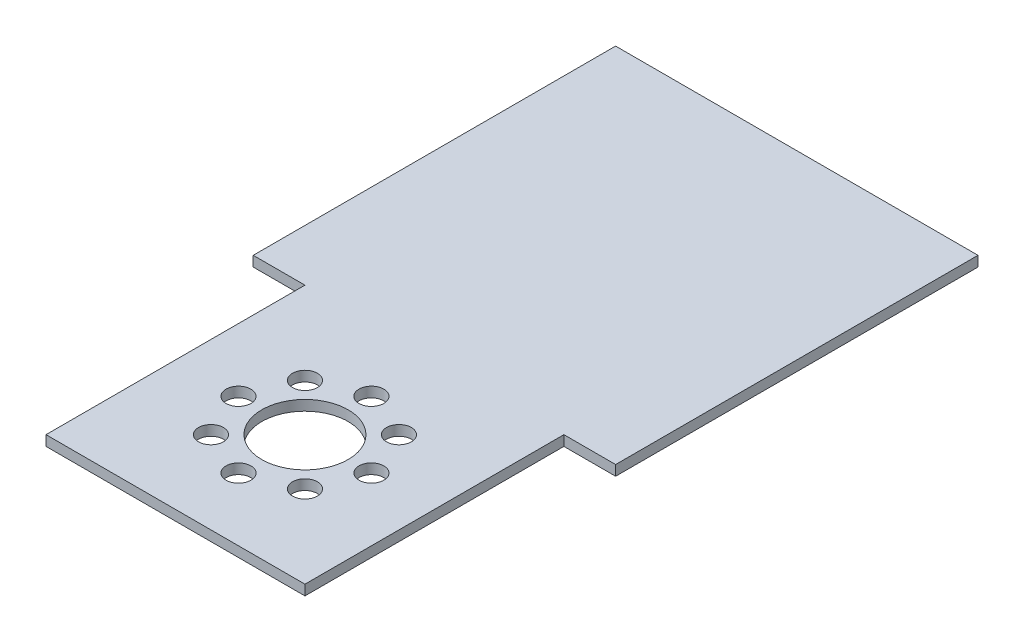
ISO-10303-21;
HEADER;
FILE_DESCRIPTION(('STEP AP214'),'2;1');
FILE_NAME('part.step','',(''),(''),'','','');
FILE_SCHEMA(('AUTOMOTIVE_DESIGN { 1 0 10303 214 1 1 1 1 }'));
ENDSEC;
DATA;
#1=APPLICATION_CONTEXT('core data for automotive mechanical design processes');
#2=APPLICATION_PROTOCOL_DEFINITION('international standard','automotive_design',2000,#1);
#3=PRODUCT_CONTEXT('',#1,'mechanical');
#4=PRODUCT('Part','Part','',(#3));
#5=PRODUCT_RELATED_PRODUCT_CATEGORY('part','',(#4));
#6=PRODUCT_DEFINITION_FORMATION('','',#4);
#7=PRODUCT_DEFINITION_CONTEXT('part definition',#1,'design');
#8=PRODUCT_DEFINITION('design','',#6,#7);
#9=PRODUCT_DEFINITION_SHAPE('','',#8);
#10=(LENGTH_UNIT() NAMED_UNIT(*) SI_UNIT(.MILLI.,.METRE.));
#11=(NAMED_UNIT(*) PLANE_ANGLE_UNIT() SI_UNIT($,.RADIAN.));
#12=(NAMED_UNIT(*) SI_UNIT($,.STERADIAN.) SOLID_ANGLE_UNIT());
#13=UNCERTAINTY_MEASURE_WITH_UNIT(LENGTH_MEASURE(1.E-05),#10,'distance_accuracy_value','');
#14=(GEOMETRIC_REPRESENTATION_CONTEXT(3) GLOBAL_UNCERTAINTY_ASSIGNED_CONTEXT((#13)) GLOBAL_UNIT_ASSIGNED_CONTEXT((#10,
#11,#12)) REPRESENTATION_CONTEXT('',''));
#15=CARTESIAN_POINT('',(0.,0.,0.));
#16=DIRECTION('',(0.,0.,1.));
#17=DIRECTION('',(1.,0.,0.));
#18=AXIS2_PLACEMENT_3D('',#15,#16,#17);
#19=CARTESIAN_POINT('',(0.,1.5,0.));
#20=DIRECTION('',(0.,1.,0.));
#21=DIRECTION('',(0.,0.,1.));
#22=AXIS2_PLACEMENT_3D('',#19,#20,#21);
#23=PLANE('',#22);
#24=CARTESIAN_POINT('',(-2.36087575437562,1.5,35.7855217391304));
#25=DIRECTION('',(0.,1.,0.));
#26=DIRECTION('',(0.,0.,1.));
#27=AXIS2_PLACEMENT_3D('',#24,#25,#26);
#28=CIRCLE('',#27,1.8288);
#29=CARTESIAN_POINT('',(-2.36087575437562,1.5,37.6143217391304));
#30=VERTEX_POINT('',#29);
#31=EDGE_CURVE('E218',#30,#30,#28,.T.);
#32=ORIENTED_EDGE('',*,*,#31,.F.);
#33=EDGE_LOOP('',(#32));
#34=FACE_BOUND('',#33,.T.);
#35=CARTESIAN_POINT('',(7.41812424562449,1.5,26.0065217391305));
#36=DIRECTION('',(0.,1.,0.));
#37=DIRECTION('',(0.,0.,1.));
#38=AXIS2_PLACEMENT_3D('',#35,#36,#37);
#39=CIRCLE('',#38,1.8288);
#40=CARTESIAN_POINT('',(7.41812424562449,1.5,27.8353217391305));
#41=VERTEX_POINT('',#40);
#42=EDGE_CURVE('E206',#41,#41,#39,.T.);
#43=ORIENTED_EDGE('',*,*,#42,.F.);
#44=EDGE_LOOP('',(#43));
#45=FACE_BOUND('',#44,.T.);
#46=CARTESIAN_POINT('',(-2.36087575437548,1.5,16.2275217391304));
#47=DIRECTION('',(0.,1.,0.));
#48=DIRECTION('',(0.,0.,1.));
#49=AXIS2_PLACEMENT_3D('',#46,#47,#48);
#50=CIRCLE('',#49,1.8288);
#51=CARTESIAN_POINT('',(-2.36087575437548,1.5,18.0563217391304));
#52=VERTEX_POINT('',#51);
#53=EDGE_CURVE('E194',#52,#52,#50,.T.);
#54=ORIENTED_EDGE('',*,*,#53,.F.);
#55=EDGE_LOOP('',(#54));
#56=FACE_BOUND('',#55,.T.);
#57=CARTESIAN_POINT('',(-9.27567296759875,1.5,19.0917245259072));
#58=DIRECTION('',(0.,1.,0.));
#59=DIRECTION('',(0.,0.,1.));
#60=AXIS2_PLACEMENT_3D('',#57,#58,#59);
#61=CIRCLE('',#60,1.8288);
#62=CARTESIAN_POINT('',(-9.27567296759875,1.5,20.9205245259072));
#63=VERTEX_POINT('',#62);
#64=EDGE_CURVE('E182',#63,#63,#61,.T.);
#65=ORIENTED_EDGE('',*,*,#64,.F.);
#66=EDGE_LOOP('',(#65));
#67=FACE_BOUND('',#66,.T.);
#68=DIRECTION('',(0.,0.,1.));
#69=VECTOR('',#68,1.);
#70=CARTESIAN_POINT('',(-21.4108757543755,1.5,6.95652173913043));
#71=LINE('',#70,#69);
#72=CARTESIAN_POINT('',(-21.4108757543755,1.5,6.95652173913043));
#73=VERTEX_POINT('',#72);
#74=CARTESIAN_POINT('',(-21.4108757543755,1.5,45.0565217391304));
#75=VERTEX_POINT('',#74);
#76=EDGE_CURVE('E145',#73,#75,#71,.T.);
#77=ORIENTED_EDGE('',*,*,#76,.T.);
#78=DIRECTION('',(1.,0.,0.));
#79=VECTOR('',#78,1.);
#80=CARTESIAN_POINT('',(-21.4108757543755,1.5,45.0565217391304));
#81=LINE('',#80,#79);
#82=CARTESIAN_POINT('',(16.6891242456245,1.5,45.0565217391304));
#83=VERTEX_POINT('',#82);
#84=EDGE_CURVE('E93',#75,#83,#81,.T.);
#85=ORIENTED_EDGE('',*,*,#84,.T.);
#86=DIRECTION('',(0.,0.,-1.));
#87=VECTOR('',#86,1.);
#88=CARTESIAN_POINT('',(16.6891242456245,1.5,6.95652173913043));
#89=LINE('',#88,#87);
#90=CARTESIAN_POINT('',(16.6891242456245,1.5,6.95652173913043));
#91=VERTEX_POINT('',#90);
#92=EDGE_CURVE('E160',#83,#91,#89,.T.);
#93=ORIENTED_EDGE('',*,*,#92,.T.);
#94=DIRECTION('',(1.,0.,0.));
#95=VECTOR('',#94,1.);
#96=CARTESIAN_POINT('',(16.6891242456245,1.5,6.95652173913043));
#97=LINE('',#96,#95);
#98=CARTESIAN_POINT('',(24.2989642456245,1.5,6.95652173913043));
#99=VERTEX_POINT('',#98);
#100=EDGE_CURVE('E173',#91,#99,#97,.T.);
#101=ORIENTED_EDGE('',*,*,#100,.T.);
#102=DIRECTION('',(0.,0.,-1.));
#103=VECTOR('',#102,1.);
#104=CARTESIAN_POINT('',(24.2989642456245,1.5,6.95652173913043));
#105=LINE('',#104,#103);
#106=CARTESIAN_POINT('',(24.2989642456245,1.5,-46.3631582608696));
#107=VERTEX_POINT('',#106);
#108=EDGE_CURVE('E112',#99,#107,#105,.T.);
#109=ORIENTED_EDGE('',*,*,#108,.T.);
#110=DIRECTION('',(-1.,0.,0.));
#111=VECTOR('',#110,1.);
#112=CARTESIAN_POINT('',(24.2989642456245,1.5,-46.3631582608696));
#113=LINE('',#112,#111);
#114=CARTESIAN_POINT('',(-29.0207157543756,1.5,-46.3631582608696));
#115=VERTEX_POINT('',#114);
#116=EDGE_CURVE('E106',#107,#115,#113,.T.);
#117=ORIENTED_EDGE('',*,*,#116,.T.);
#118=DIRECTION('',(0.,0.,1.));
#119=VECTOR('',#118,1.);
#120=CARTESIAN_POINT('',(-29.0207157543756,1.5,-46.3631582608696));
#121=LINE('',#120,#119);
#122=CARTESIAN_POINT('',(-29.0207157543755,1.5,6.95652173913043));
#123=VERTEX_POINT('',#122);
#124=EDGE_CURVE('E110',#115,#123,#121,.T.);
#125=ORIENTED_EDGE('',*,*,#124,.T.);
#126=DIRECTION('',(1.,0.,0.));
#127=VECTOR('',#126,1.);
#128=CARTESIAN_POINT('',(-29.0207157543755,1.5,6.95652173913043));
#129=LINE('',#128,#127);
#130=EDGE_CURVE('E50',#123,#73,#129,.T.);
#131=ORIENTED_EDGE('',*,*,#130,.T.);
#132=EDGE_LOOP('',(#77,#85,#93,#101,#109,#117,#125,#131));
#133=FACE_BOUND('',#132,.T.);
#134=CARTESIAN_POINT('',(-2.36087575437552,1.5,26.0065217391304));
#135=DIRECTION('',(0.,1.,0.));
#136=DIRECTION('',(0.,0.,1.));
#137=AXIS2_PLACEMENT_3D('',#134,#135,#136);
#138=CIRCLE('',#137,6.35);
#139=CARTESIAN_POINT('',(-2.36087575437552,1.5,32.3565217391304));
#140=VERTEX_POINT('',#139);
#141=EDGE_CURVE('E134',#140,#140,#138,.T.);
#142=ORIENTED_EDGE('',*,*,#141,.F.);
#143=EDGE_LOOP('',(#142));
#144=FACE_BOUND('',#143,.T.);
#145=CARTESIAN_POINT('',(-12.1398757543755,1.5,26.0065217391304));
#146=DIRECTION('',(0.,1.,0.));
#147=DIRECTION('',(0.,0.,1.));
#148=AXIS2_PLACEMENT_3D('',#145,#146,#147);
#149=CIRCLE('',#148,1.8288);
#150=CARTESIAN_POINT('',(-12.1398757543755,1.5,27.8353217391304));
#151=VERTEX_POINT('',#150);
#152=EDGE_CURVE('E188',#151,#151,#149,.T.);
#153=ORIENTED_EDGE('',*,*,#152,.F.);
#154=EDGE_LOOP('',(#153));
#155=FACE_BOUND('',#154,.T.);
#156=CARTESIAN_POINT('',(4.55392145884776,1.5,19.0917245259072));
#157=DIRECTION('',(0.,1.,0.));
#158=DIRECTION('',(0.,0.,1.));
#159=AXIS2_PLACEMENT_3D('',#156,#157,#158);
#160=CIRCLE('',#159,1.8288);
#161=CARTESIAN_POINT('',(4.55392145884776,1.5,20.9205245259072));
#162=VERTEX_POINT('',#161);
#163=EDGE_CURVE('E200',#162,#162,#160,.T.);
#164=ORIENTED_EDGE('',*,*,#163,.F.);
#165=EDGE_LOOP('',(#164));
#166=FACE_BOUND('',#165,.T.);
#167=CARTESIAN_POINT('',(4.55392145884767,1.5,32.9213189523537));
#168=DIRECTION('',(0.,1.,0.));
#169=DIRECTION('',(0.,0.,1.));
#170=AXIS2_PLACEMENT_3D('',#167,#168,#169);
#171=CIRCLE('',#170,1.8288);
#172=CARTESIAN_POINT('',(4.55392145884767,1.5,34.7501189523537));
#173=VERTEX_POINT('',#172);
#174=EDGE_CURVE('E212',#173,#173,#171,.T.);
#175=ORIENTED_EDGE('',*,*,#174,.F.);
#176=EDGE_LOOP('',(#175));
#177=FACE_BOUND('',#176,.T.);
#178=CARTESIAN_POINT('',(-9.27567296759885,1.5,32.9213189523536));
#179=DIRECTION('',(0.,1.,0.));
#180=DIRECTION('',(0.,0.,1.));
#181=AXIS2_PLACEMENT_3D('',#178,#179,#180);
#182=CIRCLE('',#181,1.8288);
#183=CARTESIAN_POINT('',(-9.27567296759885,1.5,34.7501189523536));
#184=VERTEX_POINT('',#183);
#185=EDGE_CURVE('E224',#184,#184,#182,.T.);
#186=ORIENTED_EDGE('',*,*,#185,.F.);
#187=EDGE_LOOP('',(#186));
#188=FACE_BOUND('',#187,.T.);
#189=ADVANCED_FACE('F33',(#34,#45,#56,#67,#133,#144,#155,#166,#177,#188),#23,.T.);
#190=CARTESIAN_POINT('',(0.,0.,0.));
#191=DIRECTION('',(0.,1.,0.));
#192=DIRECTION('',(0.,0.,1.));
#193=AXIS2_PLACEMENT_3D('',#190,#191,#192);
#194=PLANE('',#193);
#195=DIRECTION('',(0.,0.,1.));
#196=VECTOR('',#195,1.);
#197=CARTESIAN_POINT('',(-21.4108757543755,0.,6.95652173913043));
#198=LINE('',#197,#196);
#199=CARTESIAN_POINT('',(-21.4108757543755,0.,6.95652173913043));
#200=VERTEX_POINT('',#199);
#201=CARTESIAN_POINT('',(-21.4108757543755,0.,45.0565217391304));
#202=VERTEX_POINT('',#201);
#203=EDGE_CURVE('E130',#200,#202,#198,.T.);
#204=ORIENTED_EDGE('',*,*,#203,.F.);
#205=DIRECTION('',(1.,0.,0.));
#206=VECTOR('',#205,1.);
#207=CARTESIAN_POINT('',(-29.0207157543755,0.,6.95652173913043));
#208=LINE('',#207,#206);
#209=CARTESIAN_POINT('',(-29.0207157543755,0.,6.95652173913043));
#210=VERTEX_POINT('',#209);
#211=EDGE_CURVE('E85',#210,#200,#208,.T.);
#212=ORIENTED_EDGE('',*,*,#211,.F.);
#213=DIRECTION('',(0.,0.,1.));
#214=VECTOR('',#213,1.);
#215=CARTESIAN_POINT('',(-29.0207157543756,0.,-46.3631582608696));
#216=LINE('',#215,#214);
#217=CARTESIAN_POINT('',(-29.0207157543756,0.,-46.3631582608696));
#218=VERTEX_POINT('',#217);
#219=EDGE_CURVE('E79',#218,#210,#216,.T.);
#220=ORIENTED_EDGE('',*,*,#219,.F.);
#221=DIRECTION('',(-1.,0.,0.));
#222=VECTOR('',#221,1.);
#223=CARTESIAN_POINT('',(24.2989642456245,0.,-46.3631582608696));
#224=LINE('',#223,#222);
#225=CARTESIAN_POINT('',(24.2989642456245,0.,-46.3631582608696));
#226=VERTEX_POINT('',#225);
#227=EDGE_CURVE('E120',#226,#218,#224,.T.);
#228=ORIENTED_EDGE('',*,*,#227,.F.);
#229=DIRECTION('',(0.,0.,-1.));
#230=VECTOR('',#229,1.);
#231=CARTESIAN_POINT('',(24.2989642456245,0.,6.95652173913043));
#232=LINE('',#231,#230);
#233=CARTESIAN_POINT('',(24.2989642456245,0.,6.95652173913043));
#234=VERTEX_POINT('',#233);
#235=EDGE_CURVE('E140',#234,#226,#232,.T.);
#236=ORIENTED_EDGE('',*,*,#235,.F.);
#237=DIRECTION('',(1.,0.,0.));
#238=VECTOR('',#237,1.);
#239=CARTESIAN_POINT('',(16.6891242456245,0.,6.95652173913043));
#240=LINE('',#239,#238);
#241=CARTESIAN_POINT('',(16.6891242456245,0.,6.95652173913043));
#242=VERTEX_POINT('',#241);
#243=EDGE_CURVE('E138',#242,#234,#240,.T.);
#244=ORIENTED_EDGE('',*,*,#243,.F.);
#245=DIRECTION('',(0.,0.,-1.));
#246=VECTOR('',#245,1.);
#247=CARTESIAN_POINT('',(16.6891242456245,0.,6.95652173913043));
#248=LINE('',#247,#246);
#249=CARTESIAN_POINT('',(16.6891242456245,0.,45.0565217391304));
#250=VERTEX_POINT('',#249);
#251=EDGE_CURVE('E136',#250,#242,#248,.T.);
#252=ORIENTED_EDGE('',*,*,#251,.F.);
#253=DIRECTION('',(1.,0.,0.));
#254=VECTOR('',#253,1.);
#255=CARTESIAN_POINT('',(-21.4108757543755,0.,45.0565217391304));
#256=LINE('',#255,#254);
#257=EDGE_CURVE('E133',#202,#250,#256,.T.);
#258=ORIENTED_EDGE('',*,*,#257,.F.);
#259=EDGE_LOOP('',(#204,#212,#220,#228,#236,#244,#252,#258));
#260=FACE_BOUND('',#259,.T.);
#261=CARTESIAN_POINT('',(-2.36087575437552,0.,26.0065217391304));
#262=DIRECTION('',(0.,1.,0.));
#263=DIRECTION('',(0.,0.,1.));
#264=AXIS2_PLACEMENT_3D('',#261,#262,#263);
#265=CIRCLE('',#264,6.35);
#266=CARTESIAN_POINT('',(-2.36087575437552,0.,32.3565217391304));
#267=VERTEX_POINT('',#266);
#268=EDGE_CURVE('E179',#267,#267,#265,.T.);
#269=ORIENTED_EDGE('',*,*,#268,.T.);
#270=EDGE_LOOP('',(#269));
#271=FACE_BOUND('',#270,.T.);
#272=CARTESIAN_POINT('',(-9.27567296759875,0.,19.0917245259072));
#273=DIRECTION('',(0.,1.,0.));
#274=DIRECTION('',(0.,0.,1.));
#275=AXIS2_PLACEMENT_3D('',#272,#273,#274);
#276=CIRCLE('',#275,1.8288);
#277=CARTESIAN_POINT('',(-9.27567296759875,0.,20.9205245259072));
#278=VERTEX_POINT('',#277);
#279=EDGE_CURVE('E185',#278,#278,#276,.T.);
#280=ORIENTED_EDGE('',*,*,#279,.T.);
#281=EDGE_LOOP('',(#280));
#282=FACE_BOUND('',#281,.T.);
#283=CARTESIAN_POINT('',(-12.1398757543755,0.,26.0065217391304));
#284=DIRECTION('',(0.,1.,0.));
#285=DIRECTION('',(0.,0.,1.));
#286=AXIS2_PLACEMENT_3D('',#283,#284,#285);
#287=CIRCLE('',#286,1.8288);
#288=CARTESIAN_POINT('',(-12.1398757543755,0.,27.8353217391304));
#289=VERTEX_POINT('',#288);
#290=EDGE_CURVE('E191',#289,#289,#287,.T.);
#291=ORIENTED_EDGE('',*,*,#290,.T.);
#292=EDGE_LOOP('',(#291));
#293=FACE_BOUND('',#292,.T.);
#294=CARTESIAN_POINT('',(-2.36087575437548,0.,16.2275217391304));
#295=DIRECTION('',(0.,1.,0.));
#296=DIRECTION('',(0.,0.,1.));
#297=AXIS2_PLACEMENT_3D('',#294,#295,#296);
#298=CIRCLE('',#297,1.8288);
#299=CARTESIAN_POINT('',(-2.36087575437548,0.,18.0563217391304));
#300=VERTEX_POINT('',#299);
#301=EDGE_CURVE('E197',#300,#300,#298,.T.);
#302=ORIENTED_EDGE('',*,*,#301,.T.);
#303=EDGE_LOOP('',(#302));
#304=FACE_BOUND('',#303,.T.);
#305=CARTESIAN_POINT('',(4.55392145884776,0.,19.0917245259072));
#306=DIRECTION('',(0.,1.,0.));
#307=DIRECTION('',(0.,0.,1.));
#308=AXIS2_PLACEMENT_3D('',#305,#306,#307);
#309=CIRCLE('',#308,1.8288);
#310=CARTESIAN_POINT('',(4.55392145884776,0.,20.9205245259072));
#311=VERTEX_POINT('',#310);
#312=EDGE_CURVE('E203',#311,#311,#309,.T.);
#313=ORIENTED_EDGE('',*,*,#312,.T.);
#314=EDGE_LOOP('',(#313));
#315=FACE_BOUND('',#314,.T.);
#316=CARTESIAN_POINT('',(7.41812424562449,0.,26.0065217391305));
#317=DIRECTION('',(0.,1.,0.));
#318=DIRECTION('',(0.,0.,1.));
#319=AXIS2_PLACEMENT_3D('',#316,#317,#318);
#320=CIRCLE('',#319,1.8288);
#321=CARTESIAN_POINT('',(7.41812424562449,0.,27.8353217391305));
#322=VERTEX_POINT('',#321);
#323=EDGE_CURVE('E209',#322,#322,#320,.T.);
#324=ORIENTED_EDGE('',*,*,#323,.T.);
#325=EDGE_LOOP('',(#324));
#326=FACE_BOUND('',#325,.T.);
#327=CARTESIAN_POINT('',(4.55392145884767,0.,32.9213189523537));
#328=DIRECTION('',(0.,1.,0.));
#329=DIRECTION('',(0.,0.,1.));
#330=AXIS2_PLACEMENT_3D('',#327,#328,#329);
#331=CIRCLE('',#330,1.8288);
#332=CARTESIAN_POINT('',(4.55392145884767,0.,34.7501189523537));
#333=VERTEX_POINT('',#332);
#334=EDGE_CURVE('E215',#333,#333,#331,.T.);
#335=ORIENTED_EDGE('',*,*,#334,.T.);
#336=EDGE_LOOP('',(#335));
#337=FACE_BOUND('',#336,.T.);
#338=CARTESIAN_POINT('',(-2.36087575437562,0.,35.7855217391304));
#339=DIRECTION('',(0.,1.,0.));
#340=DIRECTION('',(0.,0.,1.));
#341=AXIS2_PLACEMENT_3D('',#338,#339,#340);
#342=CIRCLE('',#341,1.8288);
#343=CARTESIAN_POINT('',(-2.36087575437562,0.,37.6143217391304));
#344=VERTEX_POINT('',#343);
#345=EDGE_CURVE('E221',#344,#344,#342,.T.);
#346=ORIENTED_EDGE('',*,*,#345,.T.);
#347=EDGE_LOOP('',(#346));
#348=FACE_BOUND('',#347,.T.);
#349=CARTESIAN_POINT('',(-9.27567296759885,0.,32.9213189523536));
#350=DIRECTION('',(0.,1.,0.));
#351=DIRECTION('',(0.,0.,1.));
#352=AXIS2_PLACEMENT_3D('',#349,#350,#351);
#353=CIRCLE('',#352,1.8288);
#354=CARTESIAN_POINT('',(-9.27567296759885,0.,34.7501189523536));
#355=VERTEX_POINT('',#354);
#356=EDGE_CURVE('E227',#355,#355,#353,.T.);
#357=ORIENTED_EDGE('',*,*,#356,.T.);
#358=EDGE_LOOP('',(#357));
#359=FACE_BOUND('',#358,.T.);
#360=ADVANCED_FACE('F164',(#260,#271,#282,#293,#304,#315,#326,#337,#348,#359),#194,.F.);
#361=CARTESIAN_POINT('',(-21.4108757543755,1.5,6.95652173913043));
#362=DIRECTION('',(1.,0.,0.));
#363=DIRECTION('',(0.,0.,-1.));
#364=AXIS2_PLACEMENT_3D('',#361,#362,#363);
#365=PLANE('',#364);
#366=ORIENTED_EDGE('',*,*,#203,.T.);
#367=DIRECTION('',(0.,-1.,0.));
#368=VECTOR('',#367,1.);
#369=CARTESIAN_POINT('',(-21.4108757543755,1.5,45.0565217391304));
#370=LINE('',#369,#368);
#371=EDGE_CURVE('E11',#75,#202,#370,.T.);
#372=ORIENTED_EDGE('',*,*,#371,.F.);
#373=ORIENTED_EDGE('',*,*,#76,.F.);
#374=DIRECTION('',(0.,-1.,0.));
#375=VECTOR('',#374,1.);
#376=CARTESIAN_POINT('',(-21.4108757543755,1.5,6.95652173913043));
#377=LINE('',#376,#375);
#378=EDGE_CURVE('E126',#73,#200,#377,.T.);
#379=ORIENTED_EDGE('',*,*,#378,.T.);
#380=EDGE_LOOP('',(#366,#372,#373,#379));
#381=FACE_BOUND('',#380,.T.);
#382=ADVANCED_FACE('F35',(#381),#365,.F.);
#383=CARTESIAN_POINT('',(-21.4108757543755,1.5,45.0565217391304));
#384=DIRECTION('',(0.,0.,-1.));
#385=DIRECTION('',(-1.,0.,0.));
#386=AXIS2_PLACEMENT_3D('',#383,#384,#385);
#387=PLANE('',#386);
#388=ORIENTED_EDGE('',*,*,#257,.T.);
#389=DIRECTION('',(0.,-1.,0.));
#390=VECTOR('',#389,1.);
#391=CARTESIAN_POINT('',(16.6891242456245,1.5,45.0565217391304));
#392=LINE('',#391,#390);
#393=EDGE_CURVE('E42',#83,#250,#392,.T.);
#394=ORIENTED_EDGE('',*,*,#393,.F.);
#395=ORIENTED_EDGE('',*,*,#84,.F.);
#396=ORIENTED_EDGE('',*,*,#371,.T.);
#397=EDGE_LOOP('',(#388,#394,#395,#396));
#398=FACE_BOUND('',#397,.T.);
#399=ADVANCED_FACE('F261',(#398),#387,.F.);
#400=CARTESIAN_POINT('',(16.6891242456245,1.5,6.95652173913043));
#401=DIRECTION('',(-1.,0.,0.));
#402=DIRECTION('',(0.,0.,1.));
#403=AXIS2_PLACEMENT_3D('',#400,#401,#402);
#404=PLANE('',#403);
#405=ORIENTED_EDGE('',*,*,#251,.T.);
#406=DIRECTION('',(0.,-1.,0.));
#407=VECTOR('',#406,1.);
#408=CARTESIAN_POINT('',(16.6891242456245,1.5,6.95652173913043));
#409=LINE('',#408,#407);
#410=EDGE_CURVE('E152',#91,#242,#409,.T.);
#411=ORIENTED_EDGE('',*,*,#410,.F.);
#412=ORIENTED_EDGE('',*,*,#92,.F.);
#413=ORIENTED_EDGE('',*,*,#393,.T.);
#414=EDGE_LOOP('',(#405,#411,#412,#413));
#415=FACE_BOUND('',#414,.T.);
#416=ADVANCED_FACE('F158',(#415),#404,.F.);
#417=CARTESIAN_POINT('',(16.6891242456245,1.5,6.95652173913043));
#418=DIRECTION('',(0.,0.,-1.));
#419=DIRECTION('',(-1.,0.,0.));
#420=AXIS2_PLACEMENT_3D('',#417,#418,#419);
#421=PLANE('',#420);
#422=ORIENTED_EDGE('',*,*,#243,.T.);
#423=DIRECTION('',(0.,-1.,0.));
#424=VECTOR('',#423,1.);
#425=CARTESIAN_POINT('',(24.2989642456245,1.5,6.95652173913043));
#426=LINE('',#425,#424);
#427=EDGE_CURVE('E149',#99,#234,#426,.T.);
#428=ORIENTED_EDGE('',*,*,#427,.F.);
#429=ORIENTED_EDGE('',*,*,#100,.F.);
#430=ORIENTED_EDGE('',*,*,#410,.T.);
#431=EDGE_LOOP('',(#422,#428,#429,#430));
#432=FACE_BOUND('',#431,.T.);
#433=ADVANCED_FACE('F169',(#432),#421,.F.);
#434=CARTESIAN_POINT('',(24.2989642456245,1.5,6.95652173913043));
#435=DIRECTION('',(-1.,0.,0.));
#436=DIRECTION('',(0.,0.,1.));
#437=AXIS2_PLACEMENT_3D('',#434,#435,#436);
#438=PLANE('',#437);
#439=ORIENTED_EDGE('',*,*,#235,.T.);
#440=DIRECTION('',(0.,-1.,0.));
#441=VECTOR('',#440,1.);
#442=CARTESIAN_POINT('',(24.2989642456245,1.5,-46.3631582608696));
#443=LINE('',#442,#441);
#444=EDGE_CURVE('E121',#107,#226,#443,.T.);
#445=ORIENTED_EDGE('',*,*,#444,.F.);
#446=ORIENTED_EDGE('',*,*,#108,.F.);
#447=ORIENTED_EDGE('',*,*,#427,.T.);
#448=EDGE_LOOP('',(#439,#445,#446,#447));
#449=FACE_BOUND('',#448,.T.);
#450=ADVANCED_FACE('F172',(#449),#438,.F.);
#451=CARTESIAN_POINT('',(24.2989642456245,1.5,-46.3631582608696));
#452=DIRECTION('',(0.,0.,1.));
#453=DIRECTION('',(1.,0.,0.));
#454=AXIS2_PLACEMENT_3D('',#451,#452,#453);
#455=PLANE('',#454);
#456=ORIENTED_EDGE('',*,*,#227,.T.);
#457=DIRECTION('',(0.,-1.,0.));
#458=VECTOR('',#457,1.);
#459=CARTESIAN_POINT('',(-29.0207157543756,1.5,-46.3631582608696));
#460=LINE('',#459,#458);
#461=EDGE_CURVE('E117',#115,#218,#460,.T.);
#462=ORIENTED_EDGE('',*,*,#461,.F.);
#463=ORIENTED_EDGE('',*,*,#116,.F.);
#464=ORIENTED_EDGE('',*,*,#444,.T.);
#465=EDGE_LOOP('',(#456,#462,#463,#464));
#466=FACE_BOUND('',#465,.T.);
#467=ADVANCED_FACE('F118',(#466),#455,.F.);
#468=CARTESIAN_POINT('',(-29.0207157543756,1.5,-46.3631582608696));
#469=DIRECTION('',(1.,0.,0.));
#470=DIRECTION('',(0.,0.,-1.));
#471=AXIS2_PLACEMENT_3D('',#468,#469,#470);
#472=PLANE('',#471);
#473=ORIENTED_EDGE('',*,*,#219,.T.);
#474=DIRECTION('',(0.,-1.,0.));
#475=VECTOR('',#474,1.);
#476=CARTESIAN_POINT('',(-29.0207157543755,1.5,6.95652173913043));
#477=LINE('',#476,#475);
#478=EDGE_CURVE('E122',#123,#210,#477,.T.);
#479=ORIENTED_EDGE('',*,*,#478,.F.);
#480=ORIENTED_EDGE('',*,*,#124,.F.);
#481=ORIENTED_EDGE('',*,*,#461,.T.);
#482=EDGE_LOOP('',(#473,#479,#480,#481));
#483=FACE_BOUND('',#482,.T.);
#484=ADVANCED_FACE('F124',(#483),#472,.F.);
#485=CARTESIAN_POINT('',(-29.0207157543755,1.5,6.95652173913043));
#486=DIRECTION('',(0.,0.,-1.));
#487=DIRECTION('',(-1.,0.,0.));
#488=AXIS2_PLACEMENT_3D('',#485,#486,#487);
#489=PLANE('',#488);
#490=ORIENTED_EDGE('',*,*,#211,.T.);
#491=ORIENTED_EDGE('',*,*,#378,.F.);
#492=ORIENTED_EDGE('',*,*,#130,.F.);
#493=ORIENTED_EDGE('',*,*,#478,.T.);
#494=EDGE_LOOP('',(#490,#491,#492,#493));
#495=FACE_BOUND('',#494,.T.);
#496=ADVANCED_FACE('F249',(#495),#489,.F.);
#497=CARTESIAN_POINT('',(-2.36087575437552,1.5,26.0065217391304));
#498=DIRECTION('',(0.,-1.,0.));
#499=DIRECTION('',(0.,0.,-1.));
#500=AXIS2_PLACEMENT_3D('',#497,#498,#499);
#501=CYLINDRICAL_SURFACE('',#500,6.35);
#502=ORIENTED_EDGE('',*,*,#141,.T.);
#503=EDGE_LOOP('',(#502));
#504=FACE_BOUND('',#503,.T.);
#505=ORIENTED_EDGE('',*,*,#268,.F.);
#506=EDGE_LOOP('',(#505));
#507=FACE_BOUND('',#506,.T.);
#508=ADVANCED_FACE('F246',(#504,#507),#501,.F.);
#509=CARTESIAN_POINT('',(-9.27567296759875,1.5,19.0917245259072));
#510=DIRECTION('',(0.,-1.,0.));
#511=DIRECTION('',(0.,0.,-1.));
#512=AXIS2_PLACEMENT_3D('',#509,#510,#511);
#513=CYLINDRICAL_SURFACE('',#512,1.8288);
#514=ORIENTED_EDGE('',*,*,#64,.T.);
#515=EDGE_LOOP('',(#514));
#516=FACE_BOUND('',#515,.T.);
#517=ORIENTED_EDGE('',*,*,#279,.F.);
#518=EDGE_LOOP('',(#517));
#519=FACE_BOUND('',#518,.T.);
#520=ADVANCED_FACE('F325',(#516,#519),#513,.F.);
#521=CARTESIAN_POINT('',(-12.1398757543755,1.5,26.0065217391304));
#522=DIRECTION('',(0.,-1.,0.));
#523=DIRECTION('',(0.,0.,-1.));
#524=AXIS2_PLACEMENT_3D('',#521,#522,#523);
#525=CYLINDRICAL_SURFACE('',#524,1.8288);
#526=ORIENTED_EDGE('',*,*,#152,.T.);
#527=EDGE_LOOP('',(#526));
#528=FACE_BOUND('',#527,.T.);
#529=ORIENTED_EDGE('',*,*,#290,.F.);
#530=EDGE_LOOP('',(#529));
#531=FACE_BOUND('',#530,.T.);
#532=ADVANCED_FACE('F333',(#528,#531),#525,.F.);
#533=CARTESIAN_POINT('',(-2.36087575437548,1.5,16.2275217391304));
#534=DIRECTION('',(0.,-1.,0.));
#535=DIRECTION('',(0.,0.,-1.));
#536=AXIS2_PLACEMENT_3D('',#533,#534,#535);
#537=CYLINDRICAL_SURFACE('',#536,1.8288);
#538=ORIENTED_EDGE('',*,*,#53,.T.);
#539=EDGE_LOOP('',(#538));
#540=FACE_BOUND('',#539,.T.);
#541=ORIENTED_EDGE('',*,*,#301,.F.);
#542=EDGE_LOOP('',(#541));
#543=FACE_BOUND('',#542,.T.);
#544=ADVANCED_FACE('F341',(#540,#543),#537,.F.);
#545=CARTESIAN_POINT('',(4.55392145884776,1.5,19.0917245259072));
#546=DIRECTION('',(0.,-1.,0.));
#547=DIRECTION('',(0.,0.,-1.));
#548=AXIS2_PLACEMENT_3D('',#545,#546,#547);
#549=CYLINDRICAL_SURFACE('',#548,1.8288);
#550=ORIENTED_EDGE('',*,*,#163,.T.);
#551=EDGE_LOOP('',(#550));
#552=FACE_BOUND('',#551,.T.);
#553=ORIENTED_EDGE('',*,*,#312,.F.);
#554=EDGE_LOOP('',(#553));
#555=FACE_BOUND('',#554,.T.);
#556=ADVANCED_FACE('F350',(#552,#555),#549,.F.);
#557=CARTESIAN_POINT('',(7.41812424562449,1.5,26.0065217391305));
#558=DIRECTION('',(0.,-1.,0.));
#559=DIRECTION('',(0.,0.,-1.));
#560=AXIS2_PLACEMENT_3D('',#557,#558,#559);
#561=CYLINDRICAL_SURFACE('',#560,1.8288);
#562=ORIENTED_EDGE('',*,*,#42,.T.);
#563=EDGE_LOOP('',(#562));
#564=FACE_BOUND('',#563,.T.);
#565=ORIENTED_EDGE('',*,*,#323,.F.);
#566=EDGE_LOOP('',(#565));
#567=FACE_BOUND('',#566,.T.);
#568=ADVANCED_FACE('F359',(#564,#567),#561,.F.);
#569=CARTESIAN_POINT('',(4.55392145884767,1.5,32.9213189523537));
#570=DIRECTION('',(0.,-1.,0.));
#571=DIRECTION('',(0.,0.,-1.));
#572=AXIS2_PLACEMENT_3D('',#569,#570,#571);
#573=CYLINDRICAL_SURFACE('',#572,1.8288);
#574=ORIENTED_EDGE('',*,*,#174,.T.);
#575=EDGE_LOOP('',(#574));
#576=FACE_BOUND('',#575,.T.);
#577=ORIENTED_EDGE('',*,*,#334,.F.);
#578=EDGE_LOOP('',(#577));
#579=FACE_BOUND('',#578,.T.);
#580=ADVANCED_FACE('F368',(#576,#579),#573,.F.);
#581=CARTESIAN_POINT('',(-2.36087575437562,1.5,35.7855217391304));
#582=DIRECTION('',(0.,-1.,0.));
#583=DIRECTION('',(0.,0.,-1.));
#584=AXIS2_PLACEMENT_3D('',#581,#582,#583);
#585=CYLINDRICAL_SURFACE('',#584,1.8288);
#586=ORIENTED_EDGE('',*,*,#31,.T.);
#587=EDGE_LOOP('',(#586));
#588=FACE_BOUND('',#587,.T.);
#589=ORIENTED_EDGE('',*,*,#345,.F.);
#590=EDGE_LOOP('',(#589));
#591=FACE_BOUND('',#590,.T.);
#592=ADVANCED_FACE('F377',(#588,#591),#585,.F.);
#593=CARTESIAN_POINT('',(-9.27567296759885,1.5,32.9213189523536));
#594=DIRECTION('',(0.,-1.,0.));
#595=DIRECTION('',(0.,0.,-1.));
#596=AXIS2_PLACEMENT_3D('',#593,#594,#595);
#597=CYLINDRICAL_SURFACE('',#596,1.8288);
#598=ORIENTED_EDGE('',*,*,#185,.T.);
#599=EDGE_LOOP('',(#598));
#600=FACE_BOUND('',#599,.T.);
#601=ORIENTED_EDGE('',*,*,#356,.F.);
#602=EDGE_LOOP('',(#601));
#603=FACE_BOUND('',#602,.T.);
#604=ADVANCED_FACE('F233',(#600,#603),#597,.F.);
#605=CLOSED_SHELL('',(#189,#360,#382,#399,#416,#433,#450,#467,#484,#496,#508,#520,#532,#544,
#556,#568,#580,#592,#604));
#606=MANIFOLD_SOLID_BREP('B2',#605);
#607=ADVANCED_BREP_SHAPE_REPRESENTATION('',(#18,#606),#14);
#608=SHAPE_DEFINITION_REPRESENTATION(#9,#607);
ENDSEC;
END-ISO-10303-21;
